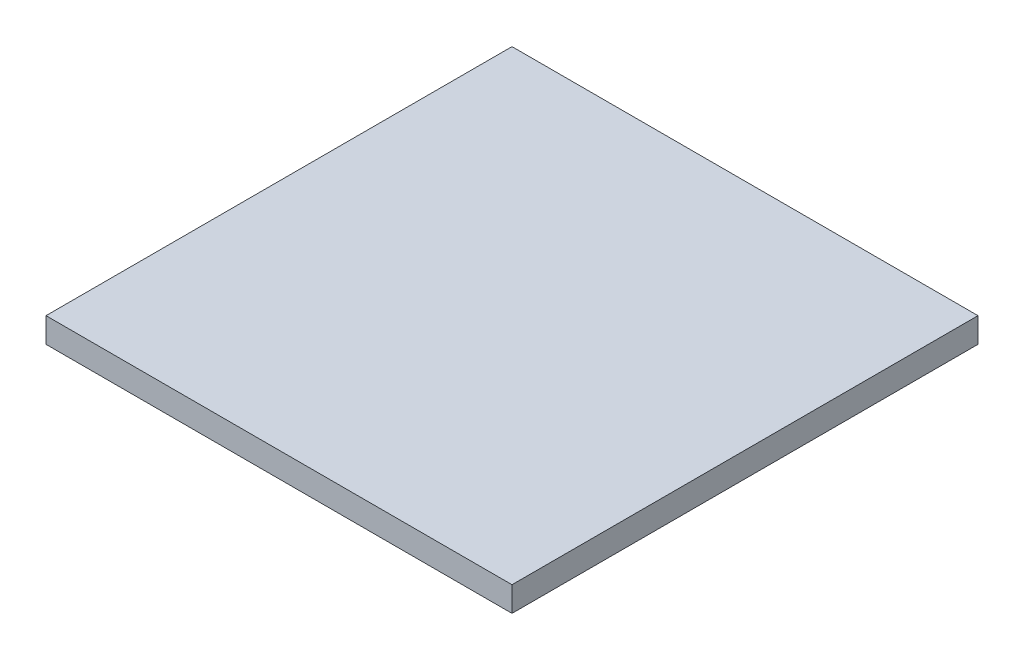
ISO-10303-21;
HEADER;
FILE_DESCRIPTION(('STEP AP214'),'2;1');
FILE_NAME('part.step','',(''),(''),'','','');
FILE_SCHEMA(('AUTOMOTIVE_DESIGN { 1 0 10303 214 1 1 1 1 }'));
ENDSEC;
DATA;
#1=APPLICATION_CONTEXT('core data for automotive mechanical design processes');
#2=APPLICATION_PROTOCOL_DEFINITION('international standard','automotive_design',2000,#1);
#3=PRODUCT_CONTEXT('',#1,'mechanical');
#4=PRODUCT('Part','Part','',(#3));
#5=PRODUCT_RELATED_PRODUCT_CATEGORY('part','',(#4));
#6=PRODUCT_DEFINITION_FORMATION('','',#4);
#7=PRODUCT_DEFINITION_CONTEXT('part definition',#1,'design');
#8=PRODUCT_DEFINITION('design','',#6,#7);
#9=PRODUCT_DEFINITION_SHAPE('','',#8);
#10=(LENGTH_UNIT() NAMED_UNIT(*) SI_UNIT(.MILLI.,.METRE.));
#11=(NAMED_UNIT(*) PLANE_ANGLE_UNIT() SI_UNIT($,.RADIAN.));
#12=(NAMED_UNIT(*) SI_UNIT($,.STERADIAN.) SOLID_ANGLE_UNIT());
#13=UNCERTAINTY_MEASURE_WITH_UNIT(LENGTH_MEASURE(1.E-05),#10,'distance_accuracy_value','');
#14=(GEOMETRIC_REPRESENTATION_CONTEXT(3) GLOBAL_UNCERTAINTY_ASSIGNED_CONTEXT((#13)) GLOBAL_UNIT_ASSIGNED_CONTEXT((#10,
#11,#12)) REPRESENTATION_CONTEXT('',''));
#15=CARTESIAN_POINT('',(0.,0.,0.));
#16=DIRECTION('',(0.,0.,1.));
#17=DIRECTION('',(1.,0.,0.));
#18=AXIS2_PLACEMENT_3D('',#15,#16,#17);
#19=CARTESIAN_POINT('',(0.,3.2,0.));
#20=DIRECTION('',(-1.,0.,0.));
#21=DIRECTION('',(0.,0.,1.));
#22=AXIS2_PLACEMENT_3D('',#19,#20,#21);
#23=PLANE('',#22);
#24=DIRECTION('',(0.,0.,-1.));
#25=VECTOR('',#24,1.);
#26=CARTESIAN_POINT('',(0.,0.,0.));
#27=LINE('',#26,#25);
#28=CARTESIAN_POINT('',(0.,0.,0.));
#29=VERTEX_POINT('',#28);
#30=CARTESIAN_POINT('',(0.,0.,-60.));
#31=VERTEX_POINT('',#30);
#32=EDGE_CURVE('E107',#29,#31,#27,.T.);
#33=ORIENTED_EDGE('',*,*,#32,.T.);
#34=DIRECTION('',(0.,-1.,0.));
#35=VECTOR('',#34,1.);
#36=CARTESIAN_POINT('',(0.,3.2,-60.));
#37=LINE('',#36,#35);
#38=CARTESIAN_POINT('',(0.,3.2,-60.));
#39=VERTEX_POINT('',#38);
#40=EDGE_CURVE('E11',#39,#31,#37,.T.);
#41=ORIENTED_EDGE('',*,*,#40,.F.);
#42=DIRECTION('',(0.,0.,-1.));
#43=VECTOR('',#42,1.);
#44=CARTESIAN_POINT('',(0.,3.2,0.));
#45=LINE('',#44,#43);
#46=CARTESIAN_POINT('',(0.,3.2,0.));
#47=VERTEX_POINT('',#46);
#48=EDGE_CURVE('E91',#47,#39,#45,.T.);
#49=ORIENTED_EDGE('',*,*,#48,.F.);
#50=DIRECTION('',(0.,-1.,0.));
#51=VECTOR('',#50,1.);
#52=CARTESIAN_POINT('',(0.,3.2,0.));
#53=LINE('',#52,#51);
#54=EDGE_CURVE('E103',#47,#29,#53,.T.);
#55=ORIENTED_EDGE('',*,*,#54,.T.);
#56=EDGE_LOOP('',(#33,#41,#49,#55));
#57=FACE_BOUND('',#56,.T.);
#58=ADVANCED_FACE('F39',(#57),#23,.F.);
#59=CARTESIAN_POINT('',(0.,3.2,-60.));
#60=DIRECTION('',(0.,0.,1.));
#61=DIRECTION('',(1.,0.,0.));
#62=AXIS2_PLACEMENT_3D('',#59,#60,#61);
#63=PLANE('',#62);
#64=DIRECTION('',(-1.,0.,0.));
#65=VECTOR('',#64,1.);
#66=CARTESIAN_POINT('',(0.,0.,-60.));
#67=LINE('',#66,#65);
#68=CARTESIAN_POINT('',(-60.,0.,-60.));
#69=VERTEX_POINT('',#68);
#70=EDGE_CURVE('E96',#31,#69,#67,.T.);
#71=ORIENTED_EDGE('',*,*,#70,.T.);
#72=DIRECTION('',(0.,-1.,0.));
#73=VECTOR('',#72,1.);
#74=CARTESIAN_POINT('',(-60.,3.2,-60.));
#75=LINE('',#74,#73);
#76=CARTESIAN_POINT('',(-60.,3.2,-60.));
#77=VERTEX_POINT('',#76);
#78=EDGE_CURVE('E48',#77,#69,#75,.T.);
#79=ORIENTED_EDGE('',*,*,#78,.F.);
#80=DIRECTION('',(-1.,0.,0.));
#81=VECTOR('',#80,1.);
#82=CARTESIAN_POINT('',(0.,3.2,-60.));
#83=LINE('',#82,#81);
#84=EDGE_CURVE('E86',#39,#77,#83,.T.);
#85=ORIENTED_EDGE('',*,*,#84,.F.);
#86=ORIENTED_EDGE('',*,*,#40,.T.);
#87=EDGE_LOOP('',(#71,#79,#85,#86));
#88=FACE_BOUND('',#87,.T.);
#89=ADVANCED_FACE('F95',(#88),#63,.F.);
#90=CARTESIAN_POINT('',(-60.,3.2,0.));
#91=DIRECTION('',(1.,0.,0.));
#92=DIRECTION('',(0.,0.,-1.));
#93=AXIS2_PLACEMENT_3D('',#90,#91,#92);
#94=PLANE('',#93);
#95=DIRECTION('',(0.,0.,1.));
#96=VECTOR('',#95,1.);
#97=CARTESIAN_POINT('',(-60.,0.,0.));
#98=LINE('',#97,#96);
#99=CARTESIAN_POINT('',(-60.,0.,0.));
#100=VERTEX_POINT('',#99);
#101=EDGE_CURVE('E73',#69,#100,#98,.T.);
#102=ORIENTED_EDGE('',*,*,#101,.T.);
#103=DIRECTION('',(0.,-1.,0.));
#104=VECTOR('',#103,1.);
#105=CARTESIAN_POINT('',(-60.,3.2,0.));
#106=LINE('',#105,#104);
#107=CARTESIAN_POINT('',(-60.,3.2,0.));
#108=VERTEX_POINT('',#107);
#109=EDGE_CURVE('E98',#108,#100,#106,.T.);
#110=ORIENTED_EDGE('',*,*,#109,.F.);
#111=DIRECTION('',(0.,0.,1.));
#112=VECTOR('',#111,1.);
#113=CARTESIAN_POINT('',(-60.,3.2,0.));
#114=LINE('',#113,#112);
#115=EDGE_CURVE('E89',#77,#108,#114,.T.);
#116=ORIENTED_EDGE('',*,*,#115,.F.);
#117=ORIENTED_EDGE('',*,*,#78,.T.);
#118=EDGE_LOOP('',(#102,#110,#116,#117));
#119=FACE_BOUND('',#118,.T.);
#120=ADVANCED_FACE('F99',(#119),#94,.F.);
#121=CARTESIAN_POINT('',(0.,3.2,0.));
#122=DIRECTION('',(0.,0.,-1.));
#123=DIRECTION('',(-1.,0.,0.));
#124=AXIS2_PLACEMENT_3D('',#121,#122,#123);
#125=PLANE('',#124);
#126=DIRECTION('',(1.,0.,0.));
#127=VECTOR('',#126,1.);
#128=CARTESIAN_POINT('',(0.,0.,0.));
#129=LINE('',#128,#127);
#130=EDGE_CURVE('E79',#100,#29,#129,.T.);
#131=ORIENTED_EDGE('',*,*,#130,.T.);
#132=ORIENTED_EDGE('',*,*,#54,.F.);
#133=DIRECTION('',(1.,0.,0.));
#134=VECTOR('',#133,1.);
#135=CARTESIAN_POINT('',(0.,3.2,0.));
#136=LINE('',#135,#134);
#137=EDGE_CURVE('E56',#108,#47,#136,.T.);
#138=ORIENTED_EDGE('',*,*,#137,.F.);
#139=ORIENTED_EDGE('',*,*,#109,.T.);
#140=EDGE_LOOP('',(#131,#132,#138,#139));
#141=FACE_BOUND('',#140,.T.);
#142=ADVANCED_FACE('F120',(#141),#125,.F.);
#143=CARTESIAN_POINT('',(0.,3.2,0.));
#144=DIRECTION('',(0.,1.,0.));
#145=DIRECTION('',(0.,0.,1.));
#146=AXIS2_PLACEMENT_3D('',#143,#144,#145);
#147=PLANE('',#146);
#148=ORIENTED_EDGE('',*,*,#48,.T.);
#149=ORIENTED_EDGE('',*,*,#84,.T.);
#150=ORIENTED_EDGE('',*,*,#115,.T.);
#151=ORIENTED_EDGE('',*,*,#137,.T.);
#152=EDGE_LOOP('',(#148,#149,#150,#151));
#153=FACE_BOUND('',#152,.T.);
#154=ADVANCED_FACE('F87',(#153),#147,.T.);
#155=CARTESIAN_POINT('',(0.,0.,0.));
#156=DIRECTION('',(0.,1.,0.));
#157=DIRECTION('',(0.,0.,1.));
#158=AXIS2_PLACEMENT_3D('',#155,#156,#157);
#159=PLANE('',#158);
#160=ORIENTED_EDGE('',*,*,#32,.F.);
#161=ORIENTED_EDGE('',*,*,#130,.F.);
#162=ORIENTED_EDGE('',*,*,#101,.F.);
#163=ORIENTED_EDGE('',*,*,#70,.F.);
#164=EDGE_LOOP('',(#160,#161,#162,#163));
#165=FACE_BOUND('',#164,.T.);
#166=ADVANCED_FACE('F123',(#165),#159,.F.);
#167=CLOSED_SHELL('',(#58,#89,#120,#142,#154,#166));
#168=MANIFOLD_SOLID_BREP('B2',#167);
#169=ADVANCED_BREP_SHAPE_REPRESENTATION('',(#18,#168),#14);
#170=SHAPE_DEFINITION_REPRESENTATION(#9,#169);
ENDSEC;
END-ISO-10303-21;
